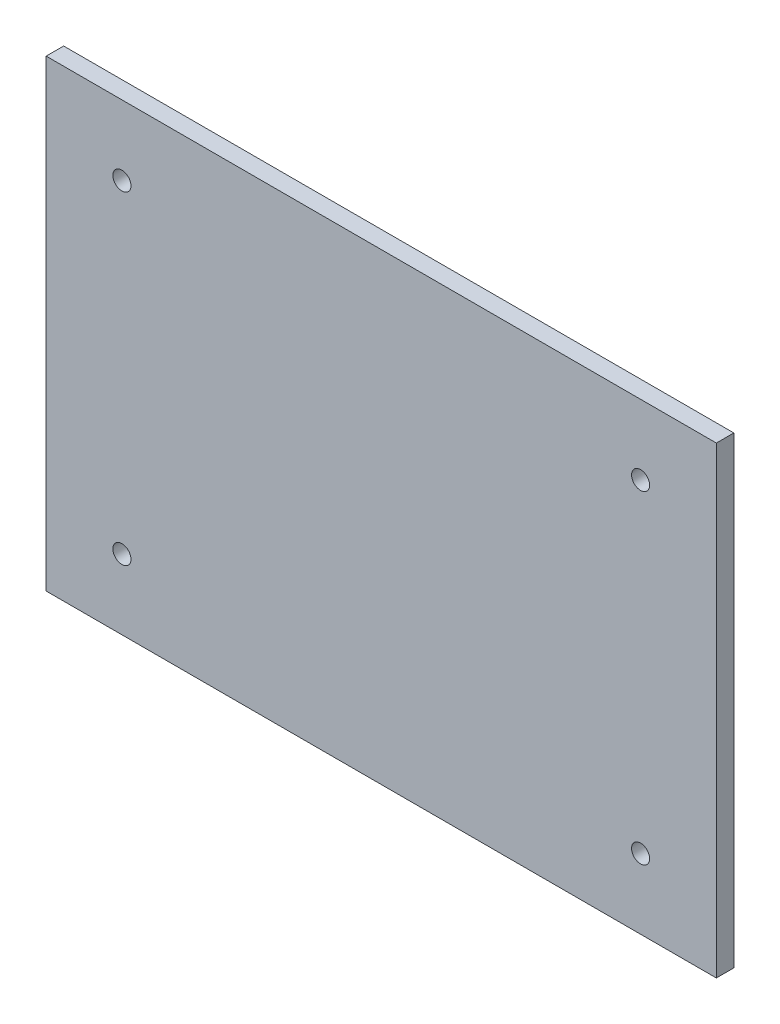
ISO-10303-21;
HEADER;
FILE_DESCRIPTION(('STEP AP214'),'2;1');
FILE_NAME('part.step','',(''),(''),'','','');
FILE_SCHEMA(('AUTOMOTIVE_DESIGN { 1 0 10303 214 1 1 1 1 }'));
ENDSEC;
DATA;
#1=APPLICATION_CONTEXT('core data for automotive mechanical design processes');
#2=APPLICATION_PROTOCOL_DEFINITION('international standard','automotive_design',2000,#1);
#3=PRODUCT_CONTEXT('',#1,'mechanical');
#4=PRODUCT('Part','Part','',(#3));
#5=PRODUCT_RELATED_PRODUCT_CATEGORY('part','',(#4));
#6=PRODUCT_DEFINITION_FORMATION('','',#4);
#7=PRODUCT_DEFINITION_CONTEXT('part definition',#1,'design');
#8=PRODUCT_DEFINITION('design','',#6,#7);
#9=PRODUCT_DEFINITION_SHAPE('','',#8);
#10=(LENGTH_UNIT() NAMED_UNIT(*) SI_UNIT(.MILLI.,.METRE.));
#11=(NAMED_UNIT(*) PLANE_ANGLE_UNIT() SI_UNIT($,.RADIAN.));
#12=(NAMED_UNIT(*) SI_UNIT($,.STERADIAN.) SOLID_ANGLE_UNIT());
#13=UNCERTAINTY_MEASURE_WITH_UNIT(LENGTH_MEASURE(1.E-05),#10,'distance_accuracy_value','');
#14=(GEOMETRIC_REPRESENTATION_CONTEXT(3) GLOBAL_UNCERTAINTY_ASSIGNED_CONTEXT((#13)) GLOBAL_UNIT_ASSIGNED_CONTEXT((#10,
#11,#12)) REPRESENTATION_CONTEXT('',''));
#15=CARTESIAN_POINT('',(0.,0.,0.));
#16=DIRECTION('',(0.,0.,1.));
#17=DIRECTION('',(1.,0.,0.));
#18=AXIS2_PLACEMENT_3D('',#15,#16,#17);
#19=CARTESIAN_POINT('',(57.5,-39.75,3.));
#20=DIRECTION('',(-1.,0.,0.));
#21=DIRECTION('',(0.,0.,1.));
#22=AXIS2_PLACEMENT_3D('',#19,#20,#21);
#23=PLANE('',#22);
#24=DIRECTION('',(0.,1.,0.));
#25=VECTOR('',#24,1.);
#26=CARTESIAN_POINT('',(57.5,-39.75,0.));
#27=LINE('',#26,#25);
#28=CARTESIAN_POINT('',(57.5,-39.75,0.));
#29=VERTEX_POINT('',#28);
#30=CARTESIAN_POINT('',(57.5,39.75,0.));
#31=VERTEX_POINT('',#30);
#32=EDGE_CURVE('E97',#29,#31,#27,.T.);
#33=ORIENTED_EDGE('',*,*,#32,.T.);
#34=DIRECTION('',(0.,0.,-1.));
#35=VECTOR('',#34,1.);
#36=CARTESIAN_POINT('',(57.5,39.75,3.));
#37=LINE('',#36,#35);
#38=CARTESIAN_POINT('',(57.5,39.75,3.));
#39=VERTEX_POINT('',#38);
#40=EDGE_CURVE('E11',#39,#31,#37,.T.);
#41=ORIENTED_EDGE('',*,*,#40,.F.);
#42=DIRECTION('',(0.,1.,0.));
#43=VECTOR('',#42,1.);
#44=CARTESIAN_POINT('',(57.5,-39.75,3.));
#45=LINE('',#44,#43);
#46=CARTESIAN_POINT('',(57.5,-39.75,3.));
#47=VERTEX_POINT('',#46);
#48=EDGE_CURVE('E85',#47,#39,#45,.T.);
#49=ORIENTED_EDGE('',*,*,#48,.F.);
#50=DIRECTION('',(0.,0.,-1.));
#51=VECTOR('',#50,1.);
#52=CARTESIAN_POINT('',(57.5,-39.75,3.));
#53=LINE('',#52,#51);
#54=EDGE_CURVE('E93',#47,#29,#53,.T.);
#55=ORIENTED_EDGE('',*,*,#54,.T.);
#56=EDGE_LOOP('',(#33,#41,#49,#55));
#57=FACE_BOUND('',#56,.T.);
#58=ADVANCED_FACE('F34',(#57),#23,.F.);
#59=CARTESIAN_POINT('',(-57.5,39.75,3.));
#60=DIRECTION('',(0.,-1.,0.));
#61=DIRECTION('',(0.,0.,-1.));
#62=AXIS2_PLACEMENT_3D('',#59,#60,#61);
#63=PLANE('',#62);
#64=DIRECTION('',(-1.,0.,0.));
#65=VECTOR('',#64,1.);
#66=CARTESIAN_POINT('',(-57.5,39.75,0.));
#67=LINE('',#66,#65);
#68=CARTESIAN_POINT('',(-57.5,39.75,0.));
#69=VERTEX_POINT('',#68);
#70=EDGE_CURVE('E89',#31,#69,#67,.T.);
#71=ORIENTED_EDGE('',*,*,#70,.T.);
#72=DIRECTION('',(0.,0.,-1.));
#73=VECTOR('',#72,1.);
#74=CARTESIAN_POINT('',(-57.5,39.75,3.));
#75=LINE('',#74,#73);
#76=CARTESIAN_POINT('',(-57.5,39.75,3.));
#77=VERTEX_POINT('',#76);
#78=EDGE_CURVE('E42',#77,#69,#75,.T.);
#79=ORIENTED_EDGE('',*,*,#78,.F.);
#80=DIRECTION('',(-1.,0.,0.));
#81=VECTOR('',#80,1.);
#82=CARTESIAN_POINT('',(-57.5,39.75,3.));
#83=LINE('',#82,#81);
#84=EDGE_CURVE('E80',#39,#77,#83,.T.);
#85=ORIENTED_EDGE('',*,*,#84,.F.);
#86=ORIENTED_EDGE('',*,*,#40,.T.);
#87=EDGE_LOOP('',(#71,#79,#85,#86));
#88=FACE_BOUND('',#87,.T.);
#89=ADVANCED_FACE('F88',(#88),#63,.F.);
#90=CARTESIAN_POINT('',(-57.5,-39.75,3.));
#91=DIRECTION('',(1.,0.,0.));
#92=DIRECTION('',(0.,0.,-1.));
#93=AXIS2_PLACEMENT_3D('',#90,#91,#92);
#94=PLANE('',#93);
#95=DIRECTION('',(0.,-1.,0.));
#96=VECTOR('',#95,1.);
#97=CARTESIAN_POINT('',(-57.5,-39.75,0.));
#98=LINE('',#97,#96);
#99=CARTESIAN_POINT('',(-57.5,-39.75,0.));
#100=VERTEX_POINT('',#99);
#101=EDGE_CURVE('E67',#69,#100,#98,.T.);
#102=ORIENTED_EDGE('',*,*,#101,.T.);
#103=DIRECTION('',(0.,0.,-1.));
#104=VECTOR('',#103,1.);
#105=CARTESIAN_POINT('',(-57.5,-39.75,3.));
#106=LINE('',#105,#104);
#107=CARTESIAN_POINT('',(-57.5,-39.75,3.));
#108=VERTEX_POINT('',#107);
#109=EDGE_CURVE('E90',#108,#100,#106,.T.);
#110=ORIENTED_EDGE('',*,*,#109,.F.);
#111=DIRECTION('',(0.,-1.,0.));
#112=VECTOR('',#111,1.);
#113=CARTESIAN_POINT('',(-57.5,-39.75,3.));
#114=LINE('',#113,#112);
#115=EDGE_CURVE('E83',#77,#108,#114,.T.);
#116=ORIENTED_EDGE('',*,*,#115,.F.);
#117=ORIENTED_EDGE('',*,*,#78,.T.);
#118=EDGE_LOOP('',(#102,#110,#116,#117));
#119=FACE_BOUND('',#118,.T.);
#120=ADVANCED_FACE('F91',(#119),#94,.F.);
#121=CARTESIAN_POINT('',(-57.5,-39.75,3.));
#122=DIRECTION('',(0.,1.,0.));
#123=DIRECTION('',(0.,0.,1.));
#124=AXIS2_PLACEMENT_3D('',#121,#122,#123);
#125=PLANE('',#124);
#126=DIRECTION('',(1.,0.,0.));
#127=VECTOR('',#126,1.);
#128=CARTESIAN_POINT('',(-57.5,-39.75,0.));
#129=LINE('',#128,#127);
#130=EDGE_CURVE('E73',#100,#29,#129,.T.);
#131=ORIENTED_EDGE('',*,*,#130,.T.);
#132=ORIENTED_EDGE('',*,*,#54,.F.);
#133=DIRECTION('',(1.,0.,0.));
#134=VECTOR('',#133,1.);
#135=CARTESIAN_POINT('',(-57.5,-39.75,3.));
#136=LINE('',#135,#134);
#137=EDGE_CURVE('E50',#108,#47,#136,.T.);
#138=ORIENTED_EDGE('',*,*,#137,.F.);
#139=ORIENTED_EDGE('',*,*,#109,.T.);
#140=EDGE_LOOP('',(#131,#132,#138,#139));
#141=FACE_BOUND('',#140,.T.);
#142=ADVANCED_FACE('F105',(#141),#125,.F.);
#143=CARTESIAN_POINT('',(0.,0.,3.));
#144=DIRECTION('',(0.,0.,-1.));
#145=DIRECTION('',(-1.,0.,0.));
#146=AXIS2_PLACEMENT_3D('',#143,#144,#145);
#147=PLANE('',#146);
#148=CARTESIAN_POINT('',(-44.5,-27.75,3.));
#149=DIRECTION('',(0.,0.,1.));
#150=DIRECTION('',(1.,0.,0.));
#151=AXIS2_PLACEMENT_3D('',#148,#149,#150);
#152=CIRCLE('',#151,1.55);
#153=CARTESIAN_POINT('',(-42.95,-27.75,3.));
#154=VERTEX_POINT('',#153);
#155=EDGE_CURVE('E117',#154,#154,#152,.T.);
#156=ORIENTED_EDGE('',*,*,#155,.F.);
#157=EDGE_LOOP('',(#156));
#158=FACE_BOUND('',#157,.T.);
#159=CARTESIAN_POINT('',(44.5,-27.75,3.));
#160=DIRECTION('',(0.,0.,1.));
#161=DIRECTION('',(1.,0.,0.));
#162=AXIS2_PLACEMENT_3D('',#159,#160,#161);
#163=CIRCLE('',#162,1.55);
#164=CARTESIAN_POINT('',(46.05,-27.75,3.));
#165=VERTEX_POINT('',#164);
#166=EDGE_CURVE('E123',#165,#165,#163,.T.);
#167=ORIENTED_EDGE('',*,*,#166,.F.);
#168=EDGE_LOOP('',(#167));
#169=FACE_BOUND('',#168,.T.);
#170=CARTESIAN_POINT('',(44.5,27.75,3.));
#171=DIRECTION('',(0.,0.,1.));
#172=DIRECTION('',(1.,0.,0.));
#173=AXIS2_PLACEMENT_3D('',#170,#171,#172);
#174=CIRCLE('',#173,1.55);
#175=CARTESIAN_POINT('',(46.05,27.75,3.));
#176=VERTEX_POINT('',#175);
#177=EDGE_CURVE('E129',#176,#176,#174,.T.);
#178=ORIENTED_EDGE('',*,*,#177,.F.);
#179=EDGE_LOOP('',(#178));
#180=FACE_BOUND('',#179,.T.);
#181=CARTESIAN_POINT('',(-44.5,27.75,3.));
#182=DIRECTION('',(0.,0.,1.));
#183=DIRECTION('',(1.,0.,0.));
#184=AXIS2_PLACEMENT_3D('',#181,#182,#183);
#185=CIRCLE('',#184,1.55);
#186=CARTESIAN_POINT('',(-42.95,27.75,3.));
#187=VERTEX_POINT('',#186);
#188=EDGE_CURVE('E111',#187,#187,#185,.T.);
#189=ORIENTED_EDGE('',*,*,#188,.F.);
#190=EDGE_LOOP('',(#189));
#191=FACE_BOUND('',#190,.T.);
#192=ORIENTED_EDGE('',*,*,#48,.T.);
#193=ORIENTED_EDGE('',*,*,#84,.T.);
#194=ORIENTED_EDGE('',*,*,#115,.T.);
#195=ORIENTED_EDGE('',*,*,#137,.T.);
#196=EDGE_LOOP('',(#192,#193,#194,#195));
#197=FACE_BOUND('',#196,.T.);
#198=ADVANCED_FACE('F81',(#158,#169,#180,#191,#197),#147,.F.);
#199=CARTESIAN_POINT('',(0.,0.,0.));
#200=DIRECTION('',(0.,0.,-1.));
#201=DIRECTION('',(-1.,0.,0.));
#202=AXIS2_PLACEMENT_3D('',#199,#200,#201);
#203=PLANE('',#202);
#204=CARTESIAN_POINT('',(-44.5,-27.75,0.));
#205=DIRECTION('',(0.,0.,1.));
#206=DIRECTION('',(1.,0.,0.));
#207=AXIS2_PLACEMENT_3D('',#204,#205,#206);
#208=CIRCLE('',#207,1.55);
#209=CARTESIAN_POINT('',(-42.95,-27.75,0.));
#210=VERTEX_POINT('',#209);
#211=EDGE_CURVE('E120',#210,#210,#208,.T.);
#212=ORIENTED_EDGE('',*,*,#211,.T.);
#213=EDGE_LOOP('',(#212));
#214=FACE_BOUND('',#213,.T.);
#215=CARTESIAN_POINT('',(44.5,-27.75,0.));
#216=DIRECTION('',(0.,0.,1.));
#217=DIRECTION('',(1.,0.,0.));
#218=AXIS2_PLACEMENT_3D('',#215,#216,#217);
#219=CIRCLE('',#218,1.55);
#220=CARTESIAN_POINT('',(46.05,-27.75,0.));
#221=VERTEX_POINT('',#220);
#222=EDGE_CURVE('E126',#221,#221,#219,.T.);
#223=ORIENTED_EDGE('',*,*,#222,.T.);
#224=EDGE_LOOP('',(#223));
#225=FACE_BOUND('',#224,.T.);
#226=CARTESIAN_POINT('',(44.5,27.75,0.));
#227=DIRECTION('',(0.,0.,1.));
#228=DIRECTION('',(1.,0.,0.));
#229=AXIS2_PLACEMENT_3D('',#226,#227,#228);
#230=CIRCLE('',#229,1.55);
#231=CARTESIAN_POINT('',(46.05,27.75,0.));
#232=VERTEX_POINT('',#231);
#233=EDGE_CURVE('E114',#232,#232,#230,.T.);
#234=ORIENTED_EDGE('',*,*,#233,.T.);
#235=EDGE_LOOP('',(#234));
#236=FACE_BOUND('',#235,.T.);
#237=CARTESIAN_POINT('',(-44.5,27.75,0.));
#238=DIRECTION('',(0.,0.,1.));
#239=DIRECTION('',(1.,0.,0.));
#240=AXIS2_PLACEMENT_3D('',#237,#238,#239);
#241=CIRCLE('',#240,1.55);
#242=CARTESIAN_POINT('',(-42.95,27.75,0.));
#243=VERTEX_POINT('',#242);
#244=EDGE_CURVE('E100',#243,#243,#241,.T.);
#245=ORIENTED_EDGE('',*,*,#244,.T.);
#246=EDGE_LOOP('',(#245));
#247=FACE_BOUND('',#246,.T.);
#248=ORIENTED_EDGE('',*,*,#32,.F.);
#249=ORIENTED_EDGE('',*,*,#130,.F.);
#250=ORIENTED_EDGE('',*,*,#101,.F.);
#251=ORIENTED_EDGE('',*,*,#70,.F.);
#252=EDGE_LOOP('',(#248,#249,#250,#251));
#253=FACE_BOUND('',#252,.T.);
#254=ADVANCED_FACE('F108',(#214,#225,#236,#247,#253),#203,.T.);
#255=CARTESIAN_POINT('',(-44.5,27.75,0.));
#256=DIRECTION('',(0.,0.,1.));
#257=DIRECTION('',(1.,0.,0.));
#258=AXIS2_PLACEMENT_3D('',#255,#256,#257);
#259=CYLINDRICAL_SURFACE('',#258,1.55);
#260=ORIENTED_EDGE('',*,*,#244,.F.);
#261=EDGE_LOOP('',(#260));
#262=FACE_BOUND('',#261,.T.);
#263=ORIENTED_EDGE('',*,*,#188,.T.);
#264=EDGE_LOOP('',(#263));
#265=FACE_BOUND('',#264,.T.);
#266=ADVANCED_FACE('F141',(#262,#265),#259,.F.);
#267=CARTESIAN_POINT('',(44.5,27.75,0.));
#268=DIRECTION('',(0.,0.,1.));
#269=DIRECTION('',(1.,0.,0.));
#270=AXIS2_PLACEMENT_3D('',#267,#268,#269);
#271=CYLINDRICAL_SURFACE('',#270,1.55);
#272=ORIENTED_EDGE('',*,*,#233,.F.);
#273=EDGE_LOOP('',(#272));
#274=FACE_BOUND('',#273,.T.);
#275=ORIENTED_EDGE('',*,*,#177,.T.);
#276=EDGE_LOOP('',(#275));
#277=FACE_BOUND('',#276,.T.);
#278=ADVANCED_FACE('F137',(#274,#277),#271,.F.);
#279=CARTESIAN_POINT('',(44.5,-27.75,0.));
#280=DIRECTION('',(0.,0.,1.));
#281=DIRECTION('',(1.,0.,0.));
#282=AXIS2_PLACEMENT_3D('',#279,#280,#281);
#283=CYLINDRICAL_SURFACE('',#282,1.55);
#284=ORIENTED_EDGE('',*,*,#222,.F.);
#285=EDGE_LOOP('',(#284));
#286=FACE_BOUND('',#285,.T.);
#287=ORIENTED_EDGE('',*,*,#166,.T.);
#288=EDGE_LOOP('',(#287));
#289=FACE_BOUND('',#288,.T.);
#290=ADVANCED_FACE('F140',(#286,#289),#283,.F.);
#291=CARTESIAN_POINT('',(-44.5,-27.75,0.));
#292=DIRECTION('',(0.,0.,1.));
#293=DIRECTION('',(1.,0.,0.));
#294=AXIS2_PLACEMENT_3D('',#291,#292,#293);
#295=CYLINDRICAL_SURFACE('',#294,1.55);
#296=ORIENTED_EDGE('',*,*,#211,.F.);
#297=EDGE_LOOP('',(#296));
#298=FACE_BOUND('',#297,.T.);
#299=ORIENTED_EDGE('',*,*,#155,.T.);
#300=EDGE_LOOP('',(#299));
#301=FACE_BOUND('',#300,.T.);
#302=ADVANCED_FACE('F202',(#298,#301),#295,.F.);
#303=CLOSED_SHELL('',(#58,#89,#120,#142,#198,#254,#266,#278,#290,#302));
#304=MANIFOLD_SOLID_BREP('B2',#303);
#305=ADVANCED_BREP_SHAPE_REPRESENTATION('',(#18,#304),#14);
#306=SHAPE_DEFINITION_REPRESENTATION(#9,#305);
ENDSEC;
END-ISO-10303-21;
